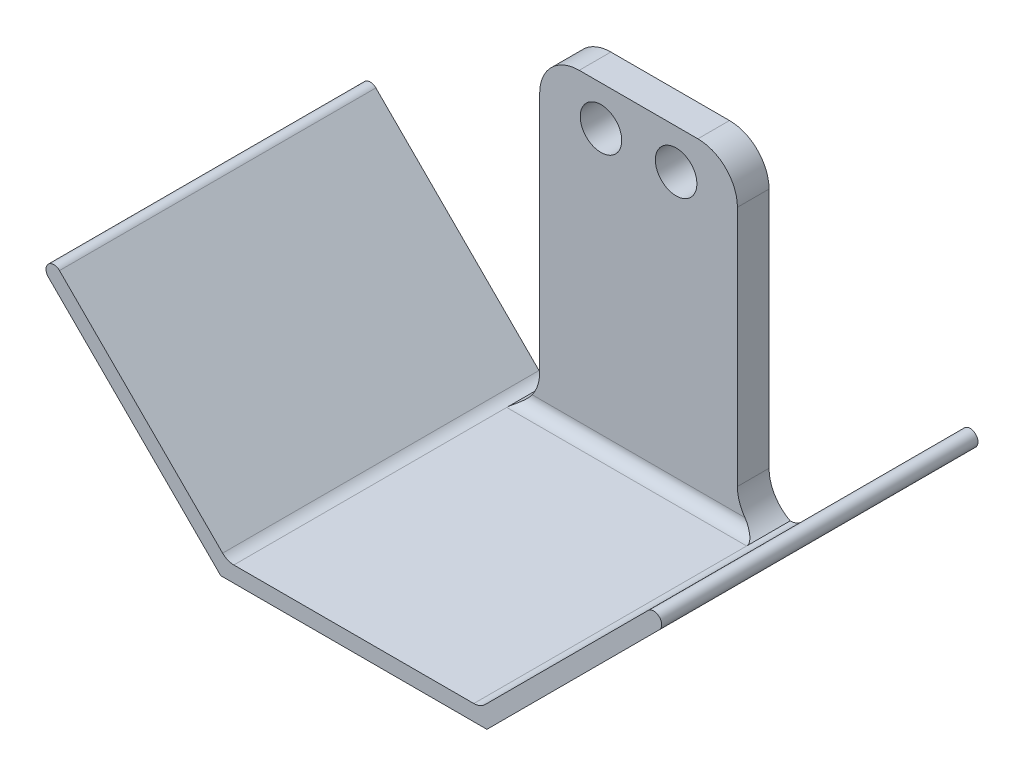
ISO-10303-21;
HEADER;
FILE_DESCRIPTION(('STEP AP214'),'2;1');
FILE_NAME('part.step','',(''),(''),'','','');
FILE_SCHEMA(('AUTOMOTIVE_DESIGN { 1 0 10303 214 1 1 1 1 }'));
ENDSEC;
DATA;
#1=APPLICATION_CONTEXT('core data for automotive mechanical design processes');
#2=APPLICATION_PROTOCOL_DEFINITION('international standard','automotive_design',2000,#1);
#3=PRODUCT_CONTEXT('',#1,'mechanical');
#4=PRODUCT('Part','Part','',(#3));
#5=PRODUCT_RELATED_PRODUCT_CATEGORY('part','',(#4));
#6=PRODUCT_DEFINITION_FORMATION('','',#4);
#7=PRODUCT_DEFINITION_CONTEXT('part definition',#1,'design');
#8=PRODUCT_DEFINITION('design','',#6,#7);
#9=PRODUCT_DEFINITION_SHAPE('','',#8);
#10=(LENGTH_UNIT() NAMED_UNIT(*) SI_UNIT(.MILLI.,.METRE.));
#11=(NAMED_UNIT(*) PLANE_ANGLE_UNIT() SI_UNIT($,.RADIAN.));
#12=(NAMED_UNIT(*) SI_UNIT($,.STERADIAN.) SOLID_ANGLE_UNIT());
#13=UNCERTAINTY_MEASURE_WITH_UNIT(LENGTH_MEASURE(1.E-05),#10,'distance_accuracy_value','');
#14=(GEOMETRIC_REPRESENTATION_CONTEXT(3) GLOBAL_UNCERTAINTY_ASSIGNED_CONTEXT((#13)) GLOBAL_UNIT_ASSIGNED_CONTEXT((#10,
#11,#12)) REPRESENTATION_CONTEXT('',''));
#15=CARTESIAN_POINT('',(0.,0.,0.));
#16=DIRECTION('',(0.,0.,1.));
#17=DIRECTION('',(1.,0.,0.));
#18=AXIS2_PLACEMENT_3D('',#15,#16,#17);
#19=CARTESIAN_POINT('',(-32.,0.,40.));
#20=DIRECTION('',(0.,-1.,0.));
#21=DIRECTION('',(1.,0.,0.));
#22=AXIS2_PLACEMENT_3D('',#19,#20,#21);
#23=PLANE('',#22);
#24=DIRECTION('',(0.,0.,-1.));
#25=VECTOR('',#24,1.);
#26=CARTESIAN_POINT('',(30.3431457505076,0.,-40.));
#27=LINE('',#26,#25);
#28=CARTESIAN_POINT('',(30.3431457505076,0.,40.));
#29=VERTEX_POINT('',#28);
#30=CARTESIAN_POINT('',(30.3431457505076,0.,-29.));
#31=VERTEX_POINT('',#30);
#32=EDGE_CURVE('E205',#29,#31,#27,.T.);
#33=ORIENTED_EDGE('',*,*,#32,.T.);
#34=DIRECTION('',(1.,0.,0.));
#35=VECTOR('',#34,1.);
#36=CARTESIAN_POINT('',(-30.3431457505076,0.,-29.));
#37=LINE('',#36,#35);
#38=CARTESIAN_POINT('',(-30.3431457505076,0.,-29.));
#39=VERTEX_POINT('',#38);
#40=EDGE_CURVE('E257',#31,#39,#37,.F.);
#41=ORIENTED_EDGE('',*,*,#40,.T.);
#42=DIRECTION('',(0.,0.,-1.));
#43=VECTOR('',#42,1.);
#44=CARTESIAN_POINT('',(-30.3431457505076,0.,40.));
#45=LINE('',#44,#43);
#46=CARTESIAN_POINT('',(-30.3431457505076,0.,40.));
#47=VERTEX_POINT('',#46);
#48=EDGE_CURVE('E198',#39,#47,#45,.F.);
#49=ORIENTED_EDGE('',*,*,#48,.T.);
#50=DIRECTION('',(-1.,0.,0.));
#51=VECTOR('',#50,1.);
#52=CARTESIAN_POINT('',(-32.,0.,40.));
#53=LINE('',#52,#51);
#54=EDGE_CURVE('E322',#29,#47,#53,.T.);
#55=ORIENTED_EDGE('',*,*,#54,.F.);
#56=EDGE_LOOP('',(#33,#41,#49,#55));
#57=FACE_BOUND('',#56,.T.);
#58=ADVANCED_FACE('F41',(#57),#23,.F.);
#59=CARTESIAN_POINT('',(-33.6568542494924,-4.,40.));
#60=DIRECTION('',(0.,1.,0.));
#61=DIRECTION('',(0.,0.,1.));
#62=AXIS2_PLACEMENT_3D('',#59,#60,#61);
#63=PLANE('',#62);
#64=DIRECTION('',(1.,0.,0.));
#65=VECTOR('',#64,1.);
#66=CARTESIAN_POINT('',(-33.6568542494924,-4.,-40.));
#67=LINE('',#66,#65);
#68=CARTESIAN_POINT('',(-33.6568542494924,-4.,-40.));
#69=VERTEX_POINT('',#68);
#70=CARTESIAN_POINT('',(33.6568542494924,-4.,-40.));
#71=VERTEX_POINT('',#70);
#72=EDGE_CURVE('E197',#69,#71,#67,.T.);
#73=ORIENTED_EDGE('',*,*,#72,.T.);
#74=DIRECTION('',(0.,0.,-1.));
#75=VECTOR('',#74,1.);
#76=CARTESIAN_POINT('',(33.6568542494924,-4.,40.));
#77=LINE('',#76,#75);
#78=CARTESIAN_POINT('',(33.6568542494924,-4.,40.));
#79=VERTEX_POINT('',#78);
#80=EDGE_CURVE('E177',#79,#71,#77,.T.);
#81=ORIENTED_EDGE('',*,*,#80,.F.);
#82=DIRECTION('',(1.,0.,0.));
#83=VECTOR('',#82,1.);
#84=CARTESIAN_POINT('',(-33.6568542494924,-4.,40.));
#85=LINE('',#84,#83);
#86=CARTESIAN_POINT('',(-33.6568542494924,-4.,40.));
#87=VERTEX_POINT('',#86);
#88=EDGE_CURVE('E184',#87,#79,#85,.T.);
#89=ORIENTED_EDGE('',*,*,#88,.F.);
#90=DIRECTION('',(0.,0.,-1.));
#91=VECTOR('',#90,1.);
#92=CARTESIAN_POINT('',(-33.6568542494924,-4.,40.));
#93=LINE('',#92,#91);
#94=EDGE_CURVE('E337',#87,#69,#93,.T.);
#95=ORIENTED_EDGE('',*,*,#94,.T.);
#96=EDGE_LOOP('',(#73,#81,#89,#95));
#97=FACE_BOUND('',#96,.T.);
#98=ADVANCED_FACE('F195',(#97),#63,.F.);
#99=CARTESIAN_POINT('',(33.6568542494924,-4.,40.));
#100=DIRECTION('',(-0.707106781186549,0.707106781186546,0.));
#101=DIRECTION('',(-0.707106781186546,-0.707106781186549,0.));
#102=AXIS2_PLACEMENT_3D('',#99,#100,#101);
#103=PLANE('',#102);
#104=DIRECTION('',(0.707106781186546,0.707106781186549,0.));
#105=VECTOR('',#104,1.);
#106=CARTESIAN_POINT('',(33.6568542494924,-4.,-40.));
#107=LINE('',#106,#105);
#108=CARTESIAN_POINT('',(77.254833995939,39.5979797464467,-40.));
#109=VERTEX_POINT('',#108);
#110=EDGE_CURVE('E339',#71,#109,#107,.T.);
#111=ORIENTED_EDGE('',*,*,#110,.T.);
#112=DIRECTION('',(0.,0.,-1.));
#113=VECTOR('',#112,1.);
#114=CARTESIAN_POINT('',(77.254833995939,39.5979797464467,40.));
#115=LINE('',#114,#113);
#116=CARTESIAN_POINT('',(77.254833995939,39.5979797464467,40.));
#117=VERTEX_POINT('',#116);
#118=EDGE_CURVE('E180',#117,#109,#115,.T.);
#119=ORIENTED_EDGE('',*,*,#118,.F.);
#120=DIRECTION('',(0.707106781186546,0.707106781186549,0.));
#121=VECTOR('',#120,1.);
#122=CARTESIAN_POINT('',(33.6568542494924,-4.,40.));
#123=LINE('',#122,#121);
#124=EDGE_CURVE('E173',#79,#117,#123,.T.);
#125=ORIENTED_EDGE('',*,*,#124,.F.);
#126=ORIENTED_EDGE('',*,*,#80,.T.);
#127=EDGE_LOOP('',(#111,#119,#125,#126));
#128=FACE_BOUND('',#127,.T.);
#129=ADVANCED_FACE('F175',(#128),#103,.F.);
#130=CARTESIAN_POINT('',(75.8406204335659,41.0121933088198,40.));
#131=DIRECTION('',(0.,0.,-1.));
#132=DIRECTION('',(-1.,0.,0.));
#133=AXIS2_PLACEMENT_3D('',#130,#131,#132);
#134=CYLINDRICAL_SURFACE('',#133,2.);
#135=CARTESIAN_POINT('',(75.8406204335659,41.0121933088198,-40.));
#136=DIRECTION('',(0.,0.,1.));
#137=DIRECTION('',(-1.,0.,0.));
#138=AXIS2_PLACEMENT_3D('',#135,#136,#137);
#139=CIRCLE('',#138,2.);
#140=CARTESIAN_POINT('',(74.4264068711928,42.4264068711929,-40.));
#141=VERTEX_POINT('',#140);
#142=EDGE_CURVE('E342',#109,#141,#139,.T.);
#143=ORIENTED_EDGE('',*,*,#142,.T.);
#144=DIRECTION('',(0.,0.,-1.));
#145=VECTOR('',#144,1.);
#146=CARTESIAN_POINT('',(74.4264068711928,42.4264068711929,40.));
#147=LINE('',#146,#145);
#148=CARTESIAN_POINT('',(74.4264068711928,42.4264068711929,40.));
#149=VERTEX_POINT('',#148);
#150=EDGE_CURVE('E201',#149,#141,#147,.T.);
#151=ORIENTED_EDGE('',*,*,#150,.F.);
#152=CARTESIAN_POINT('',(75.8406204335659,41.0121933088198,40.));
#153=DIRECTION('',(0.,0.,1.));
#154=DIRECTION('',(-1.,0.,0.));
#155=AXIS2_PLACEMENT_3D('',#152,#153,#154);
#156=CIRCLE('',#155,2.);
#157=EDGE_CURVE('E183',#117,#149,#156,.T.);
#158=ORIENTED_EDGE('',*,*,#157,.F.);
#159=ORIENTED_EDGE('',*,*,#118,.T.);
#160=EDGE_LOOP('',(#143,#151,#158,#159));
#161=FACE_BOUND('',#160,.T.);
#162=ADVANCED_FACE('F300',(#161),#134,.T.);
#163=CARTESIAN_POINT('',(32.,0.,40.));
#164=DIRECTION('',(0.707106781186549,-0.707106781186546,0.));
#165=DIRECTION('',(0.707106781186546,0.707106781186549,0.));
#166=AXIS2_PLACEMENT_3D('',#163,#164,#165);
#167=PLANE('',#166);
#168=DIRECTION('',(-0.707106781186546,-0.707106781186549,0.));
#169=VECTOR('',#168,1.);
#170=CARTESIAN_POINT('',(32.,0.,-40.));
#171=LINE('',#170,#169);
#172=CARTESIAN_POINT('',(33.1715728752538,1.17157287525383,-40.));
#173=VERTEX_POINT('',#172);
#174=EDGE_CURVE('E344',#141,#173,#171,.T.);
#175=ORIENTED_EDGE('',*,*,#174,.T.);
#176=DIRECTION('',(0.,0.,-1.));
#177=VECTOR('',#176,1.);
#178=CARTESIAN_POINT('',(33.1715728752538,1.17157287525383,40.));
#179=LINE('',#178,#177);
#180=CARTESIAN_POINT('',(33.1715728752538,1.17157287525383,40.));
#181=VERTEX_POINT('',#180);
#182=EDGE_CURVE('E208',#173,#181,#179,.F.);
#183=ORIENTED_EDGE('',*,*,#182,.T.);
#184=DIRECTION('',(-0.707106781186546,-0.707106781186549,0.));
#185=VECTOR('',#184,1.);
#186=CARTESIAN_POINT('',(32.,0.,40.));
#187=LINE('',#186,#185);
#188=EDGE_CURVE('E325',#149,#181,#187,.T.);
#189=ORIENTED_EDGE('',*,*,#188,.F.);
#190=ORIENTED_EDGE('',*,*,#150,.T.);
#191=EDGE_LOOP('',(#175,#183,#189,#190));
#192=FACE_BOUND('',#191,.T.);
#193=ADVANCED_FACE('F297',(#192),#167,.F.);
#194=CARTESIAN_POINT('',(-32.,0.,40.));
#195=DIRECTION('',(-0.707106781186544,-0.707106781186552,0.));
#196=DIRECTION('',(0.707106781186551,-0.707106781186544,0.));
#197=AXIS2_PLACEMENT_3D('',#194,#195,#196);
#198=PLANE('',#197);
#199=DIRECTION('',(-0.707106781186552,0.707106781186544,0.));
#200=VECTOR('',#199,1.);
#201=CARTESIAN_POINT('',(-32.,0.,40.));
#202=LINE('',#201,#200);
#203=CARTESIAN_POINT('',(-33.1715728752538,1.1715728752538,40.));
#204=VERTEX_POINT('',#203);
#205=CARTESIAN_POINT('',(-74.4264068711931,42.4264068711926,40.));
#206=VERTEX_POINT('',#205);
#207=EDGE_CURVE('E328',#204,#206,#202,.T.);
#208=ORIENTED_EDGE('',*,*,#207,.F.);
#209=DIRECTION('',(0.,0.,-1.));
#210=VECTOR('',#209,1.);
#211=CARTESIAN_POINT('',(-33.1715728752538,1.17157287525379,-40.));
#212=LINE('',#211,#210);
#213=CARTESIAN_POINT('',(-33.1715728752538,1.1715728752538,-40.));
#214=VERTEX_POINT('',#213);
#215=EDGE_CURVE('E210',#204,#214,#212,.T.);
#216=ORIENTED_EDGE('',*,*,#215,.T.);
#217=DIRECTION('',(-0.707106781186552,0.707106781186544,0.));
#218=VECTOR('',#217,1.);
#219=CARTESIAN_POINT('',(-32.,0.,-40.));
#220=LINE('',#219,#218);
#221=CARTESIAN_POINT('',(-74.4264068711931,42.4264068711926,-40.));
#222=VERTEX_POINT('',#221);
#223=EDGE_CURVE('E347',#214,#222,#220,.T.);
#224=ORIENTED_EDGE('',*,*,#223,.T.);
#225=DIRECTION('',(0.,0.,-1.));
#226=VECTOR('',#225,1.);
#227=CARTESIAN_POINT('',(-74.4264068711931,42.4264068711926,40.));
#228=LINE('',#227,#226);
#229=EDGE_CURVE('E356',#206,#222,#228,.T.);
#230=ORIENTED_EDGE('',*,*,#229,.F.);
#231=EDGE_LOOP('',(#208,#216,#224,#230));
#232=FACE_BOUND('',#231,.T.);
#233=ADVANCED_FACE('F295',(#232),#198,.F.);
#234=CARTESIAN_POINT('',(-75.8406204335662,41.0121933088195,40.));
#235=DIRECTION('',(0.,0.,-1.));
#236=DIRECTION('',(-1.,0.,0.));
#237=AXIS2_PLACEMENT_3D('',#234,#235,#236);
#238=CYLINDRICAL_SURFACE('',#237,2.);
#239=CARTESIAN_POINT('',(-75.8406204335662,41.0121933088195,-40.));
#240=DIRECTION('',(0.,0.,1.));
#241=DIRECTION('',(1.,0.,0.));
#242=AXIS2_PLACEMENT_3D('',#239,#240,#241);
#243=CIRCLE('',#242,2.);
#244=CARTESIAN_POINT('',(-77.2548339959393,39.5979797464464,-40.));
#245=VERTEX_POINT('',#244);
#246=EDGE_CURVE('E349',#222,#245,#243,.T.);
#247=ORIENTED_EDGE('',*,*,#246,.T.);
#248=DIRECTION('',(0.,0.,-1.));
#249=VECTOR('',#248,1.);
#250=CARTESIAN_POINT('',(-77.2548339959393,39.5979797464464,40.));
#251=LINE('',#250,#249);
#252=CARTESIAN_POINT('',(-77.2548339959393,39.5979797464464,40.));
#253=VERTEX_POINT('',#252);
#254=EDGE_CURVE('E353',#253,#245,#251,.T.);
#255=ORIENTED_EDGE('',*,*,#254,.F.);
#256=CARTESIAN_POINT('',(-75.8406204335662,41.0121933088195,40.));
#257=DIRECTION('',(0.,0.,1.));
#258=DIRECTION('',(1.,0.,0.));
#259=AXIS2_PLACEMENT_3D('',#256,#257,#258);
#260=CIRCLE('',#259,2.);
#261=EDGE_CURVE('E330',#206,#253,#260,.T.);
#262=ORIENTED_EDGE('',*,*,#261,.F.);
#263=ORIENTED_EDGE('',*,*,#229,.T.);
#264=EDGE_LOOP('',(#247,#255,#262,#263));
#265=FACE_BOUND('',#264,.T.);
#266=ADVANCED_FACE('F445',(#265),#238,.T.);
#267=CARTESIAN_POINT('',(-33.6568542494924,-4.,40.));
#268=DIRECTION('',(0.707106781186543,0.707106781186552,0.));
#269=DIRECTION('',(-0.707106781186552,0.707106781186543,0.));
#270=AXIS2_PLACEMENT_3D('',#267,#268,#269);
#271=PLANE('',#270);
#272=DIRECTION('',(0.707106781186552,-0.707106781186543,0.));
#273=VECTOR('',#272,1.);
#274=CARTESIAN_POINT('',(-33.6568542494924,-4.,-40.));
#275=LINE('',#274,#273);
#276=EDGE_CURVE('E193',#245,#69,#275,.T.);
#277=ORIENTED_EDGE('',*,*,#276,.T.);
#278=ORIENTED_EDGE('',*,*,#94,.F.);
#279=DIRECTION('',(0.707106781186552,-0.707106781186543,0.));
#280=VECTOR('',#279,1.);
#281=CARTESIAN_POINT('',(-33.6568542494924,-4.,40.));
#282=LINE('',#281,#280);
#283=EDGE_CURVE('E189',#253,#87,#282,.T.);
#284=ORIENTED_EDGE('',*,*,#283,.F.);
#285=ORIENTED_EDGE('',*,*,#254,.T.);
#286=EDGE_LOOP('',(#277,#278,#284,#285));
#287=FACE_BOUND('',#286,.T.);
#288=ADVANCED_FACE('F442',(#287),#271,.F.);
#289=CARTESIAN_POINT('',(75.8406204335659,41.0121933088198,40.));
#290=DIRECTION('',(0.,0.,-1.));
#291=DIRECTION('',(-1.,0.,0.));
#292=AXIS2_PLACEMENT_3D('',#289,#290,#291);
#293=PLANE('',#292);
#294=ORIENTED_EDGE('',*,*,#88,.T.);
#295=ORIENTED_EDGE('',*,*,#124,.T.);
#296=ORIENTED_EDGE('',*,*,#157,.T.);
#297=ORIENTED_EDGE('',*,*,#188,.T.);
#298=CARTESIAN_POINT('',(30.3431457505076,4.00000000000001,40.));
#299=DIRECTION('',(0.,0.,-1.));
#300=DIRECTION('',(-1.,0.,0.));
#301=AXIS2_PLACEMENT_3D('',#298,#299,#300);
#302=CIRCLE('',#301,4.);
#303=EDGE_CURVE('E215',#181,#29,#302,.T.);
#304=ORIENTED_EDGE('',*,*,#303,.T.);
#305=ORIENTED_EDGE('',*,*,#54,.T.);
#306=CARTESIAN_POINT('',(-30.3431457505076,4.,40.));
#307=DIRECTION('',(0.,0.,-1.));
#308=DIRECTION('',(-1.,0.,0.));
#309=AXIS2_PLACEMENT_3D('',#306,#307,#308);
#310=CIRCLE('',#309,4.);
#311=EDGE_CURVE('E219',#47,#204,#310,.T.);
#312=ORIENTED_EDGE('',*,*,#311,.T.);
#313=ORIENTED_EDGE('',*,*,#207,.T.);
#314=ORIENTED_EDGE('',*,*,#261,.T.);
#315=ORIENTED_EDGE('',*,*,#283,.T.);
#316=EDGE_LOOP('',(#294,#295,#296,#297,#304,#305,#312,#313,#314,#315));
#317=FACE_BOUND('',#316,.T.);
#318=ADVANCED_FACE('F187',(#317),#293,.F.);
#319=CARTESIAN_POINT('',(75.8406204335659,41.0121933088198,-40.));
#320=DIRECTION('',(0.,0.,-1.));
#321=DIRECTION('',(-1.,0.,0.));
#322=AXIS2_PLACEMENT_3D('',#319,#320,#321);
#323=PLANE('',#322);
#324=CARTESIAN_POINT('',(-9.50000000000001,70.,-40.));
#325=DIRECTION('',(0.,0.,1.));
#326=DIRECTION('',(1.,0.,0.));
#327=AXIS2_PLACEMENT_3D('',#324,#325,#326);
#328=CIRCLE('',#327,5.25);
#329=CARTESIAN_POINT('',(-4.25000000000001,70.,-40.));
#330=VERTEX_POINT('',#329);
#331=EDGE_CURVE('E404',#330,#330,#328,.T.);
#332=ORIENTED_EDGE('',*,*,#331,.T.);
#333=EDGE_LOOP('',(#332));
#334=FACE_BOUND('',#333,.T.);
#335=CARTESIAN_POINT('',(9.49999999999999,70.,-40.));
#336=DIRECTION('',(0.,0.,1.));
#337=DIRECTION('',(1.,0.,0.));
#338=AXIS2_PLACEMENT_3D('',#335,#336,#337);
#339=CIRCLE('',#338,5.25);
#340=CARTESIAN_POINT('',(14.75,70.,-40.));
#341=VERTEX_POINT('',#340);
#342=EDGE_CURVE('E409',#341,#341,#339,.T.);
#343=ORIENTED_EDGE('',*,*,#342,.T.);
#344=EDGE_LOOP('',(#343));
#345=FACE_BOUND('',#344,.T.);
#346=DIRECTION('',(-1.,0.,0.));
#347=VECTOR('',#346,1.);
#348=CARTESIAN_POINT('',(-25.,80.,-40.));
#349=LINE('',#348,#347);
#350=CARTESIAN_POINT('',(15.,80.,-40.));
#351=VERTEX_POINT('',#350);
#352=CARTESIAN_POINT('',(-15.,80.,-40.));
#353=VERTEX_POINT('',#352);
#354=EDGE_CURVE('E383',#351,#353,#349,.T.);
#355=ORIENTED_EDGE('',*,*,#354,.F.);
#356=CARTESIAN_POINT('',(15.,70.,-40.));
#357=DIRECTION('',(0.,0.,-1.));
#358=DIRECTION('',(-1.,0.,0.));
#359=AXIS2_PLACEMENT_3D('',#356,#357,#358);
#360=CIRCLE('',#359,10.);
#361=CARTESIAN_POINT('',(25.,70.,-40.));
#362=VERTEX_POINT('',#361);
#363=EDGE_CURVE('E234',#351,#362,#360,.T.);
#364=ORIENTED_EDGE('',*,*,#363,.T.);
#365=DIRECTION('',(0.,-1.,0.));
#366=VECTOR('',#365,1.);
#367=CARTESIAN_POINT('',(25.,80.,-40.));
#368=LINE('',#367,#366);
#369=CARTESIAN_POINT('',(25.,8.84950329108843,-40.));
#370=VERTEX_POINT('',#369);
#371=EDGE_CURVE('E382',#362,#370,#368,.T.);
#372=ORIENTED_EDGE('',*,*,#371,.T.);
#373=CARTESIAN_POINT('',(35.,8.84950329108843,-40.));
#374=DIRECTION('',(0.,0.,-1.));
#375=DIRECTION('',(-1.,0.,0.));
#376=AXIS2_PLACEMENT_3D('',#373,#374,#375);
#377=CIRCLE('',#376,10.);
#378=CARTESIAN_POINT('',(30.3431457505076,0.,-40.));
#379=VERTEX_POINT('',#378);
#380=EDGE_CURVE('E245',#370,#379,#377,.F.);
#381=ORIENTED_EDGE('',*,*,#380,.T.);
#382=CARTESIAN_POINT('',(30.3431457505076,4.00000000000001,-40.));
#383=DIRECTION('',(0.,0.,-1.));
#384=DIRECTION('',(-1.,0.,0.));
#385=AXIS2_PLACEMENT_3D('',#382,#383,#384);
#386=CIRCLE('',#385,4.);
#387=EDGE_CURVE('E213',#379,#173,#386,.F.);
#388=ORIENTED_EDGE('',*,*,#387,.T.);
#389=ORIENTED_EDGE('',*,*,#174,.F.);
#390=ORIENTED_EDGE('',*,*,#142,.F.);
#391=ORIENTED_EDGE('',*,*,#110,.F.);
#392=ORIENTED_EDGE('',*,*,#72,.F.);
#393=ORIENTED_EDGE('',*,*,#276,.F.);
#394=ORIENTED_EDGE('',*,*,#246,.F.);
#395=ORIENTED_EDGE('',*,*,#223,.F.);
#396=CARTESIAN_POINT('',(-30.3431457505076,4.,-40.));
#397=DIRECTION('',(0.,0.,-1.));
#398=DIRECTION('',(-1.,0.,0.));
#399=AXIS2_PLACEMENT_3D('',#396,#397,#398);
#400=CIRCLE('',#399,4.);
#401=CARTESIAN_POINT('',(-30.3431457505076,0.,-40.));
#402=VERTEX_POINT('',#401);
#403=EDGE_CURVE('E217',#214,#402,#400,.F.);
#404=ORIENTED_EDGE('',*,*,#403,.T.);
#405=CARTESIAN_POINT('',(-35.,8.84950329108842,-40.));
#406=DIRECTION('',(0.,0.,-1.));
#407=DIRECTION('',(-1.,0.,0.));
#408=AXIS2_PLACEMENT_3D('',#405,#406,#407);
#409=CIRCLE('',#408,10.);
#410=CARTESIAN_POINT('',(-25.,8.84950329108843,-40.));
#411=VERTEX_POINT('',#410);
#412=EDGE_CURVE('E252',#402,#411,#409,.F.);
#413=ORIENTED_EDGE('',*,*,#412,.T.);
#414=DIRECTION('',(0.,-1.,0.));
#415=VECTOR('',#414,1.);
#416=CARTESIAN_POINT('',(-25.,80.,-40.));
#417=LINE('',#416,#415);
#418=CARTESIAN_POINT('',(-25.,70.,-40.));
#419=VERTEX_POINT('',#418);
#420=EDGE_CURVE('E380',#419,#411,#417,.T.);
#421=ORIENTED_EDGE('',*,*,#420,.F.);
#422=CARTESIAN_POINT('',(-15.,70.,-40.));
#423=DIRECTION('',(0.,0.,-1.));
#424=DIRECTION('',(-1.,0.,0.));
#425=AXIS2_PLACEMENT_3D('',#422,#423,#424);
#426=CIRCLE('',#425,10.);
#427=EDGE_CURVE('E232',#419,#353,#426,.T.);
#428=ORIENTED_EDGE('',*,*,#427,.T.);
#429=EDGE_LOOP('',(#355,#364,#372,#381,#388,#389,#390,#391,#392,#393,#394,#395,#404,#413,#421,#428));
#430=FACE_BOUND('',#429,.T.);
#431=ADVANCED_FACE('F308',(#334,#345,#430),#323,.T.);
#432=CARTESIAN_POINT('',(30.3431457505076,4.00000000000001,40.));
#433=DIRECTION('',(0.,0.,1.));
#434=DIRECTION('',(1.,0.,0.));
#435=AXIS2_PLACEMENT_3D('',#432,#433,#434);
#436=CYLINDRICAL_SURFACE('',#435,4.);
#437=ORIENTED_EDGE('',*,*,#303,.F.);
#438=ORIENTED_EDGE('',*,*,#182,.F.);
#439=ORIENTED_EDGE('',*,*,#387,.F.);
#440=EDGE_CURVE('E68',#31,#379,#27,.T.);
#441=ORIENTED_EDGE('',*,*,#440,.F.);
#442=ORIENTED_EDGE('',*,*,#32,.F.);
#443=EDGE_LOOP('',(#437,#438,#439,#441,#442));
#444=FACE_BOUND('',#443,.T.);
#445=ADVANCED_FACE('F306',(#444),#436,.F.);
#446=CARTESIAN_POINT('',(-30.3431457505076,4.,40.));
#447=DIRECTION('',(0.,0.,1.));
#448=DIRECTION('',(1.,0.,0.));
#449=AXIS2_PLACEMENT_3D('',#446,#447,#448);
#450=CYLINDRICAL_SURFACE('',#449,4.);
#451=ORIENTED_EDGE('',*,*,#311,.F.);
#452=ORIENTED_EDGE('',*,*,#48,.F.);
#453=EDGE_CURVE('E60',#402,#39,#45,.F.);
#454=ORIENTED_EDGE('',*,*,#453,.F.);
#455=ORIENTED_EDGE('',*,*,#403,.F.);
#456=ORIENTED_EDGE('',*,*,#215,.F.);
#457=EDGE_LOOP('',(#451,#452,#454,#455,#456));
#458=FACE_BOUND('',#457,.T.);
#459=ADVANCED_FACE('F271',(#458),#450,.F.);
#460=CARTESIAN_POINT('',(-25.,80.,-40.));
#461=DIRECTION('',(1.,0.,0.));
#462=DIRECTION('',(0.,1.,0.));
#463=AXIS2_PLACEMENT_3D('',#460,#461,#462);
#464=PLANE('',#463);
#465=DIRECTION('',(0.,-1.,0.));
#466=VECTOR('',#465,1.);
#467=CARTESIAN_POINT('',(-25.,80.,-32.));
#468=LINE('',#467,#466);
#469=CARTESIAN_POINT('',(-25.,70.,-32.));
#470=VERTEX_POINT('',#469);
#471=CARTESIAN_POINT('',(-25.,8.84950329108843,-32.));
#472=VERTEX_POINT('',#471);
#473=EDGE_CURVE('E340',#470,#472,#468,.T.);
#474=ORIENTED_EDGE('',*,*,#473,.F.);
#475=DIRECTION('',(0.,0.,1.));
#476=VECTOR('',#475,1.);
#477=CARTESIAN_POINT('',(-25.,70.,-40.));
#478=LINE('',#477,#476);
#479=EDGE_CURVE('E243',#470,#419,#478,.F.);
#480=ORIENTED_EDGE('',*,*,#479,.T.);
#481=ORIENTED_EDGE('',*,*,#420,.T.);
#482=DIRECTION('',(0.,0.,-1.));
#483=VECTOR('',#482,1.);
#484=CARTESIAN_POINT('',(-25.,8.84950329108843,-40.));
#485=LINE('',#484,#483);
#486=EDGE_CURVE('E240',#411,#472,#485,.F.);
#487=ORIENTED_EDGE('',*,*,#486,.T.);
#488=EDGE_LOOP('',(#474,#480,#481,#487));
#489=FACE_BOUND('',#488,.T.);
#490=ADVANCED_FACE('F313',(#489),#464,.F.);
#491=CARTESIAN_POINT('',(-25.,80.,-32.));
#492=DIRECTION('',(0.,0.,-1.));
#493=DIRECTION('',(-1.,0.,0.));
#494=AXIS2_PLACEMENT_3D('',#491,#492,#493);
#495=PLANE('',#494);
#496=CARTESIAN_POINT('',(-9.50000000000001,70.,-32.));
#497=DIRECTION('',(0.,0.,1.));
#498=DIRECTION('',(1.,0.,0.));
#499=AXIS2_PLACEMENT_3D('',#496,#497,#498);
#500=CIRCLE('',#499,5.25);
#501=CARTESIAN_POINT('',(-4.25000000000001,70.,-32.));
#502=VERTEX_POINT('',#501);
#503=EDGE_CURVE('E406',#502,#502,#500,.T.);
#504=ORIENTED_EDGE('',*,*,#503,.F.);
#505=EDGE_LOOP('',(#504));
#506=FACE_BOUND('',#505,.T.);
#507=CARTESIAN_POINT('',(9.49999999999999,70.,-32.));
#508=DIRECTION('',(0.,0.,1.));
#509=DIRECTION('',(1.,0.,0.));
#510=AXIS2_PLACEMENT_3D('',#507,#508,#509);
#511=CIRCLE('',#510,5.25);
#512=CARTESIAN_POINT('',(14.75,70.,-32.));
#513=VERTEX_POINT('',#512);
#514=EDGE_CURVE('E412',#513,#513,#511,.T.);
#515=ORIENTED_EDGE('',*,*,#514,.F.);
#516=EDGE_LOOP('',(#515));
#517=FACE_BOUND('',#516,.T.);
#518=CARTESIAN_POINT('',(-35.,8.84950329108842,-32.));
#519=DIRECTION('',(0.,0.,-1.));
#520=DIRECTION('',(-1.,0.,0.));
#521=AXIS2_PLACEMENT_3D('',#518,#519,#520);
#522=CIRCLE('',#521,10.);
#523=CARTESIAN_POINT('',(-26.8893088304667,3.,-32.));
#524=VERTEX_POINT('',#523);
#525=EDGE_CURVE('E249',#472,#524,#522,.T.);
#526=ORIENTED_EDGE('',*,*,#525,.T.);
#527=DIRECTION('',(1.,0.,0.));
#528=VECTOR('',#527,1.);
#529=CARTESIAN_POINT('',(30.3431457505076,3.00000000000001,-32.));
#530=LINE('',#529,#528);
#531=CARTESIAN_POINT('',(26.8893088304667,3.00000000000001,-32.));
#532=VERTEX_POINT('',#531);
#533=EDGE_CURVE('E254',#524,#532,#530,.T.);
#534=ORIENTED_EDGE('',*,*,#533,.T.);
#535=CARTESIAN_POINT('',(35.,8.84950329108843,-32.));
#536=DIRECTION('',(0.,0.,-1.));
#537=DIRECTION('',(-1.,0.,0.));
#538=AXIS2_PLACEMENT_3D('',#535,#536,#537);
#539=CIRCLE('',#538,10.);
#540=CARTESIAN_POINT('',(25.,8.84950329108843,-32.));
#541=VERTEX_POINT('',#540);
#542=EDGE_CURVE('E247',#532,#541,#539,.T.);
#543=ORIENTED_EDGE('',*,*,#542,.T.);
#544=DIRECTION('',(0.,-1.,0.));
#545=VECTOR('',#544,1.);
#546=CARTESIAN_POINT('',(25.,80.,-32.));
#547=LINE('',#546,#545);
#548=CARTESIAN_POINT('',(25.,70.,-32.));
#549=VERTEX_POINT('',#548);
#550=EDGE_CURVE('E385',#549,#541,#547,.T.);
#551=ORIENTED_EDGE('',*,*,#550,.F.);
#552=CARTESIAN_POINT('',(15.,70.,-32.));
#553=DIRECTION('',(0.,0.,-1.));
#554=DIRECTION('',(-1.,0.,0.));
#555=AXIS2_PLACEMENT_3D('',#552,#553,#554);
#556=CIRCLE('',#555,10.);
#557=CARTESIAN_POINT('',(15.,80.,-32.));
#558=VERTEX_POINT('',#557);
#559=EDGE_CURVE('E238',#549,#558,#556,.F.);
#560=ORIENTED_EDGE('',*,*,#559,.T.);
#561=DIRECTION('',(1.,0.,0.));
#562=VECTOR('',#561,1.);
#563=CARTESIAN_POINT('',(-25.,80.,-32.));
#564=LINE('',#563,#562);
#565=CARTESIAN_POINT('',(-15.,80.,-32.));
#566=VERTEX_POINT('',#565);
#567=EDGE_CURVE('E388',#566,#558,#564,.T.);
#568=ORIENTED_EDGE('',*,*,#567,.F.);
#569=CARTESIAN_POINT('',(-15.,70.,-32.));
#570=DIRECTION('',(0.,0.,-1.));
#571=DIRECTION('',(-1.,0.,0.));
#572=AXIS2_PLACEMENT_3D('',#569,#570,#571);
#573=CIRCLE('',#572,10.);
#574=EDGE_CURVE('E236',#566,#470,#573,.F.);
#575=ORIENTED_EDGE('',*,*,#574,.T.);
#576=ORIENTED_EDGE('',*,*,#473,.T.);
#577=EDGE_LOOP('',(#526,#534,#543,#551,#560,#568,#575,#576));
#578=FACE_BOUND('',#577,.T.);
#579=ADVANCED_FACE('F370',(#506,#517,#578),#495,.F.);
#580=CARTESIAN_POINT('',(25.,80.,-40.));
#581=DIRECTION('',(-1.,0.,0.));
#582=DIRECTION('',(0.,-1.,0.));
#583=AXIS2_PLACEMENT_3D('',#580,#581,#582);
#584=PLANE('',#583);
#585=ORIENTED_EDGE('',*,*,#550,.T.);
#586=DIRECTION('',(0.,0.,-1.));
#587=VECTOR('',#586,1.);
#588=CARTESIAN_POINT('',(25.,8.84950329108843,-40.));
#589=LINE('',#588,#587);
#590=EDGE_CURVE('E223',#541,#370,#589,.T.);
#591=ORIENTED_EDGE('',*,*,#590,.T.);
#592=ORIENTED_EDGE('',*,*,#371,.F.);
#593=DIRECTION('',(0.,0.,-1.));
#594=VECTOR('',#593,1.);
#595=CARTESIAN_POINT('',(25.,70.,-32.));
#596=LINE('',#595,#594);
#597=EDGE_CURVE('E221',#362,#549,#596,.F.);
#598=ORIENTED_EDGE('',*,*,#597,.T.);
#599=EDGE_LOOP('',(#585,#591,#592,#598));
#600=FACE_BOUND('',#599,.T.);
#601=ADVANCED_FACE('F394',(#600),#584,.F.);
#602=CARTESIAN_POINT('',(0.,80.,0.));
#603=DIRECTION('',(0.,1.,0.));
#604=DIRECTION('',(-1.,0.,0.));
#605=AXIS2_PLACEMENT_3D('',#602,#603,#604);
#606=PLANE('',#605);
#607=ORIENTED_EDGE('',*,*,#567,.T.);
#608=DIRECTION('',(0.,0.,-1.));
#609=VECTOR('',#608,1.);
#610=CARTESIAN_POINT('',(15.,80.,-40.));
#611=LINE('',#610,#609);
#612=EDGE_CURVE('E229',#558,#351,#611,.T.);
#613=ORIENTED_EDGE('',*,*,#612,.T.);
#614=ORIENTED_EDGE('',*,*,#354,.T.);
#615=DIRECTION('',(0.,0.,1.));
#616=VECTOR('',#615,1.);
#617=CARTESIAN_POINT('',(-15.,80.,-32.));
#618=LINE('',#617,#616);
#619=EDGE_CURVE('E226',#353,#566,#618,.T.);
#620=ORIENTED_EDGE('',*,*,#619,.T.);
#621=EDGE_LOOP('',(#607,#613,#614,#620));
#622=FACE_BOUND('',#621,.T.);
#623=ADVANCED_FACE('F402',(#622),#606,.T.);
#624=CARTESIAN_POINT('',(9.49999999999999,70.,-40.));
#625=DIRECTION('',(0.,0.,1.));
#626=DIRECTION('',(1.,0.,0.));
#627=AXIS2_PLACEMENT_3D('',#624,#625,#626);
#628=CYLINDRICAL_SURFACE('',#627,5.25);
#629=ORIENTED_EDGE('',*,*,#342,.F.);
#630=EDGE_LOOP('',(#629));
#631=FACE_BOUND('',#630,.T.);
#632=ORIENTED_EDGE('',*,*,#514,.T.);
#633=EDGE_LOOP('',(#632));
#634=FACE_BOUND('',#633,.T.);
#635=ADVANCED_FACE('F424',(#631,#634),#628,.F.);
#636=CARTESIAN_POINT('',(-9.50000000000001,70.,-40.));
#637=DIRECTION('',(0.,0.,1.));
#638=DIRECTION('',(1.,0.,0.));
#639=AXIS2_PLACEMENT_3D('',#636,#637,#638);
#640=CYLINDRICAL_SURFACE('',#639,5.25);
#641=ORIENTED_EDGE('',*,*,#331,.F.);
#642=EDGE_LOOP('',(#641));
#643=FACE_BOUND('',#642,.T.);
#644=ORIENTED_EDGE('',*,*,#503,.T.);
#645=EDGE_LOOP('',(#644));
#646=FACE_BOUND('',#645,.T.);
#647=ADVANCED_FACE('F269',(#643,#646),#640,.F.);
#648=CARTESIAN_POINT('',(35.,8.84950329108843,40.));
#649=DIRECTION('',(0.,0.,-1.));
#650=DIRECTION('',(-1.,0.,0.));
#651=AXIS2_PLACEMENT_3D('',#648,#649,#650);
#652=CYLINDRICAL_SURFACE('',#651,10.);
#653=ORIENTED_EDGE('',*,*,#542,.F.);
#654=CARTESIAN_POINT('',(26.8893088304667,3.00000000000001,-32.));
#655=CARTESIAN_POINT('',(26.9640580787888,2.89632401972982,-31.9999890257793));
#656=CARTESIAN_POINT('',(27.0407798957604,2.79416433125974,-31.9946277456328));
#657=CARTESIAN_POINT('',(27.1974788480802,2.59356641075009,-31.9740510323529));
#658=CARTESIAN_POINT('',(27.2774522617198,2.49512415971392,-31.9588465836079));
#659=CARTESIAN_POINT('',(27.4397388777579,2.30288426389391,-31.919521938344));
#660=CARTESIAN_POINT('',(27.5220388341875,2.20906638846482,-31.8954453897688));
#661=CARTESIAN_POINT('',(27.6887774336619,2.02591239535953,-31.8390729082126));
#662=CARTESIAN_POINT('',(27.7732167280921,1.93657766800195,-31.8067744440705));
#663=CARTESIAN_POINT('',(28.0348945672245,1.66962815957346,-31.6959457065506));
#664=CARTESIAN_POINT('',(28.2148956226265,1.49966696367307,-31.6048889991943));
#665=CARTESIAN_POINT('',(28.4862909004987,1.26094117900066,-31.4463896171258));
#666=CARTESIAN_POINT('',(28.5771315733597,1.18396085447132,-31.3897982556616));
#667=CARTESIAN_POINT('',(28.7585633447493,1.03553098059353,-31.2693602538579));
#668=CARTESIAN_POINT('',(28.8491544770588,0.964080643167704,-31.2055146505315));
#669=CARTESIAN_POINT('',(29.0139268318308,0.838524865805973,-31.081925773054));
#670=CARTESIAN_POINT('',(29.0882885888177,0.783531405553955,-31.0233192938356));
#671=CARTESIAN_POINT('',(29.2355606492587,0.677633466883535,-30.9008335685795));
#672=CARTESIAN_POINT('',(29.3084712058498,0.626728270551231,-30.8369552523077));
#673=CARTESIAN_POINT('',(29.451816455306,0.529338228404342,-30.703709694127));
#674=CARTESIAN_POINT('',(29.5222566998676,0.48284300882226,-30.6343560742928));
#675=CARTESIAN_POINT('',(29.6596043346746,0.394514743658265,-30.4895095466013));
#676=CARTESIAN_POINT('',(29.7265139514379,0.352678740891709,-30.4140205860631));
#677=CARTESIAN_POINT('',(29.8574908606644,0.272750261307979,-30.2531873071577));
#678=CARTESIAN_POINT('',(29.9213606271832,0.234854235821121,-30.1675812693213));
#679=CARTESIAN_POINT('',(30.0405236015227,0.165706411316573,-29.9879416232452));
#680=CARTESIAN_POINT('',(30.0958190435122,0.134452880707954,-29.8939102204704));
#681=CARTESIAN_POINT('',(30.185268431179,0.0847705478361695,-29.7132328263332));
#682=CARTESIAN_POINT('',(30.2214065893024,0.06507542535023,-29.6279388467308));
#683=CARTESIAN_POINT('',(30.2810494843228,0.0328897331147628,-29.4518691063338));
#684=CARTESIAN_POINT('',(30.3046006604762,0.0203726675015524,-29.3611148899151));
#685=CARTESIAN_POINT('',(30.3278127119939,0.00808174897634537,-29.2245132568924));
#686=CARTESIAN_POINT('',(30.3335272724171,0.00506651517632406,-29.1799342535893));
#687=CARTESIAN_POINT('',(30.3412074713546,0.00101979238314022,-29.0902484573623));
#688=CARTESIAN_POINT('',(30.3431631607101,-6.43206552994554E-06,-29.0451405808299));
#689=CARTESIAN_POINT('',(30.3431457505076,0.,-29.));
#690=B_SPLINE_CURVE_WITH_KNOTS('',3,(#654,#655,#656,#657,#658,#659,#660,#661,#662,#663,#664,
#665,#666,#667,#668,#669,#670,#671,#672,#673,#674,#675,#676,#677,#678,#679,#680,#681,#682,#683,
#684,#685,#686,#687,#688,#689),.UNSPECIFIED.,.F.,.F.,(4,2,2,2,2,2,2,2,2,2,2,2,2,2,2,2,2,4),(0.,
0.383191371777813,0.76595586026204,1.14686187496446,1.52788529575585,2.31598789574313,
2.71127870798188,3.10651308327995,3.43480393147872,3.76303700399108,4.0904777465485,
4.41770946501431,4.757080669045,5.09636329568861,5.37951246344395,5.66160962103596,
5.79656142883904,5.93186994424808),.UNSPECIFIED.);
#691=EDGE_CURVE('E54',#532,#31,#690,.T.);
#692=ORIENTED_EDGE('',*,*,#691,.T.);
#693=ORIENTED_EDGE('',*,*,#440,.T.);
#694=ORIENTED_EDGE('',*,*,#380,.F.);
#695=ORIENTED_EDGE('',*,*,#590,.F.);
#696=EDGE_LOOP('',(#653,#692,#693,#694,#695));
#697=FACE_BOUND('',#696,.T.);
#698=ADVANCED_FACE('F263',(#697),#652,.F.);
#699=CARTESIAN_POINT('',(15.,70.,0.));
#700=DIRECTION('',(0.,0.,1.));
#701=DIRECTION('',(1.,0.,0.));
#702=AXIS2_PLACEMENT_3D('',#699,#700,#701);
#703=CYLINDRICAL_SURFACE('',#702,10.);
#704=ORIENTED_EDGE('',*,*,#559,.F.);
#705=ORIENTED_EDGE('',*,*,#597,.F.);
#706=ORIENTED_EDGE('',*,*,#363,.F.);
#707=ORIENTED_EDGE('',*,*,#612,.F.);
#708=EDGE_LOOP('',(#704,#705,#706,#707));
#709=FACE_BOUND('',#708,.T.);
#710=ADVANCED_FACE('F268',(#709),#703,.T.);
#711=CARTESIAN_POINT('',(-15.,70.,0.));
#712=DIRECTION('',(0.,0.,-1.));
#713=DIRECTION('',(-1.,0.,0.));
#714=AXIS2_PLACEMENT_3D('',#711,#712,#713);
#715=CYLINDRICAL_SURFACE('',#714,10.);
#716=ORIENTED_EDGE('',*,*,#427,.F.);
#717=ORIENTED_EDGE('',*,*,#479,.F.);
#718=ORIENTED_EDGE('',*,*,#574,.F.);
#719=ORIENTED_EDGE('',*,*,#619,.F.);
#720=EDGE_LOOP('',(#716,#717,#718,#719));
#721=FACE_BOUND('',#720,.T.);
#722=ADVANCED_FACE('F275',(#721),#715,.T.);
#723=CARTESIAN_POINT('',(-35.,8.84950329108842,40.));
#724=DIRECTION('',(0.,0.,-1.));
#725=DIRECTION('',(-1.,0.,0.));
#726=AXIS2_PLACEMENT_3D('',#723,#724,#725);
#727=CYLINDRICAL_SURFACE('',#726,10.);
#728=ORIENTED_EDGE('',*,*,#412,.F.);
#729=ORIENTED_EDGE('',*,*,#453,.T.);
#730=CARTESIAN_POINT('',(-30.3431457505076,0.,-29.));
#731=CARTESIAN_POINT('',(-30.3431634381767,-6.77532809267329E-06,-29.0442893358317));
#732=CARTESIAN_POINT('',(-30.3412805234797,0.000981361903291117,-29.0885512668023));
#733=CARTESIAN_POINT('',(-30.3338789077348,0.00488111314014595,-29.1766191729678));
#734=CARTESIAN_POINT('',(-30.3283657182051,0.00778981134995572,-29.2204257372546));
#735=CARTESIAN_POINT('',(-30.3068291784387,0.0191909976872079,-29.3495056458026));
#736=CARTESIAN_POINT('',(-30.2857985301358,0.0303629036313335,-29.4337390894126));
#737=CARTESIAN_POINT('',(-30.2243510455514,0.0634508669756263,-29.6234650935891));
#738=CARTESIAN_POINT('',(-30.1798964295801,0.0876536200907121,-29.7272017761822));
#739=CARTESIAN_POINT('',(-30.0778018755999,0.144597177195122,-29.9259981757116));
#740=CARTESIAN_POINT('',(-30.0200766870366,0.177393384950027,-30.0209959752066));
#741=CARTESIAN_POINT('',(-29.9041526985334,0.245070521845592,-30.1906217762847));
#742=CARTESIAN_POINT('',(-29.846976218228,0.279136335492618,-30.2662964565617));
#743=CARTESIAN_POINT('',(-29.7281386389878,0.351719503771198,-30.4118168713282));
#744=CARTESIAN_POINT('',(-29.6664742140334,0.390240172611809,-30.4816581986775));
#745=CARTESIAN_POINT('',(-29.5399961393106,0.471316549419981,-30.6161475874226));
#746=CARTESIAN_POINT('',(-29.4751776387944,0.513878574886356,-30.6807872161074));
#747=CARTESIAN_POINT('',(-29.343443755612,0.60270440614932,-30.8052188396727));
#748=CARTESIAN_POINT('',(-29.2765277707167,0.648969281140796,-30.865009424289));
#749=CARTESIAN_POINT('',(-29.1037476794166,0.771704840152648,-31.0120410631196));
#750=CARTESIAN_POINT('',(-28.9969076640388,0.850671944214498,-31.096068744877));
#751=CARTESIAN_POINT('',(-28.7818380656824,1.0166908791458,-31.2537944689335));
#752=CARTESIAN_POINT('',(-28.6736078388363,1.10374658176971,-31.3274875215835));
#753=CARTESIAN_POINT('',(-28.4574040034276,1.28548717774067,-31.4644189076084));
#754=CARTESIAN_POINT('',(-28.3494303267441,1.38015593393479,-31.5276785305355));
#755=CARTESIAN_POINT('',(-28.1346775442464,1.57705089520615,-31.6435311655919));
#756=CARTESIAN_POINT('',(-28.0278982046742,1.6792755905301,-31.6961263007747));
#757=CARTESIAN_POINT('',(-27.831205192168,1.87634131670278,-31.7834037618261));
#758=CARTESIAN_POINT('',(-27.7410039151268,1.97024404798186,-31.8195581247332));
#759=CARTESIAN_POINT('',(-27.5629363787622,2.16315052760829,-31.8827031984636));
#760=CARTESIAN_POINT('',(-27.4750691589054,2.26215212673606,-31.9096977344124));
#761=CARTESIAN_POINT('',(-27.302040189661,2.46520844861105,-31.9537815226901));
#762=CARTESIAN_POINT('',(-27.2168876365712,2.56927783671804,-31.9708399179176));
#763=CARTESIAN_POINT('',(-27.0501820071984,2.78165590844098,-31.9939495143499));
#764=CARTESIAN_POINT('',(-26.9686339413635,2.88997012126717,-31.9999858364042));
#765=CARTESIAN_POINT('',(-26.8893088304667,3.,-32.));
#766=B_SPLINE_CURVE_WITH_KNOTS('',3,(#730,#731,#732,#733,#734,#735,#736,#737,#738,#739,#740,
#741,#742,#743,#744,#745,#746,#747,#748,#749,#750,#751,#752,#753,#754,#755,#756,#757,#758,#759,
#760,#761,#762,#763,#764,#765),.UNSPECIFIED.,.F.,.F.,(4,2,2,2,2,2,2,2,2,2,2,2,2,2,2,2,2,4),(0.,
0.132767859291878,0.265334612468262,0.526628301169385,0.870999265653965,1.21764755802358,
1.5195642613066,1.82170703953714,2.12433016074373,2.42704098159419,2.89800015520997,
3.36918593491683,3.83939802892711,4.3095164224553,4.7145225776877,5.11935939441736,
5.52544683650934,5.93208206862587),.UNSPECIFIED.);
#767=EDGE_CURVE('E11',#39,#524,#766,.T.);
#768=ORIENTED_EDGE('',*,*,#767,.T.);
#769=ORIENTED_EDGE('',*,*,#525,.F.);
#770=ORIENTED_EDGE('',*,*,#486,.F.);
#771=EDGE_LOOP('',(#728,#729,#768,#769,#770));
#772=FACE_BOUND('',#771,.T.);
#773=ADVANCED_FACE('F278',(#772),#727,.F.);
#774=CARTESIAN_POINT('',(-25.,3.,-29.));
#775=DIRECTION('',(-1.,0.,0.));
#776=DIRECTION('',(0.,-1.,0.));
#777=AXIS2_PLACEMENT_3D('',#774,#775,#776);
#778=CYLINDRICAL_SURFACE('',#777,3.);
#779=ORIENTED_EDGE('',*,*,#767,.F.);
#780=ORIENTED_EDGE('',*,*,#40,.F.);
#781=ORIENTED_EDGE('',*,*,#691,.F.);
#782=ORIENTED_EDGE('',*,*,#533,.F.);
#783=EDGE_LOOP('',(#779,#780,#781,#782));
#784=FACE_BOUND('',#783,.T.);
#785=ADVANCED_FACE('F43',(#784),#778,.F.);
#786=CLOSED_SHELL('',(#58,#98,#129,#162,#193,#233,#266,#288,#318,#431,#445,#459,#490,#579,#601,
#623,#635,#647,#698,#710,#722,#773,#785));
#787=MANIFOLD_SOLID_BREP('B2',#786);
#788=ADVANCED_BREP_SHAPE_REPRESENTATION('',(#18,#787),#14);
#789=SHAPE_DEFINITION_REPRESENTATION(#9,#788);
ENDSEC;
END-ISO-10303-21;
